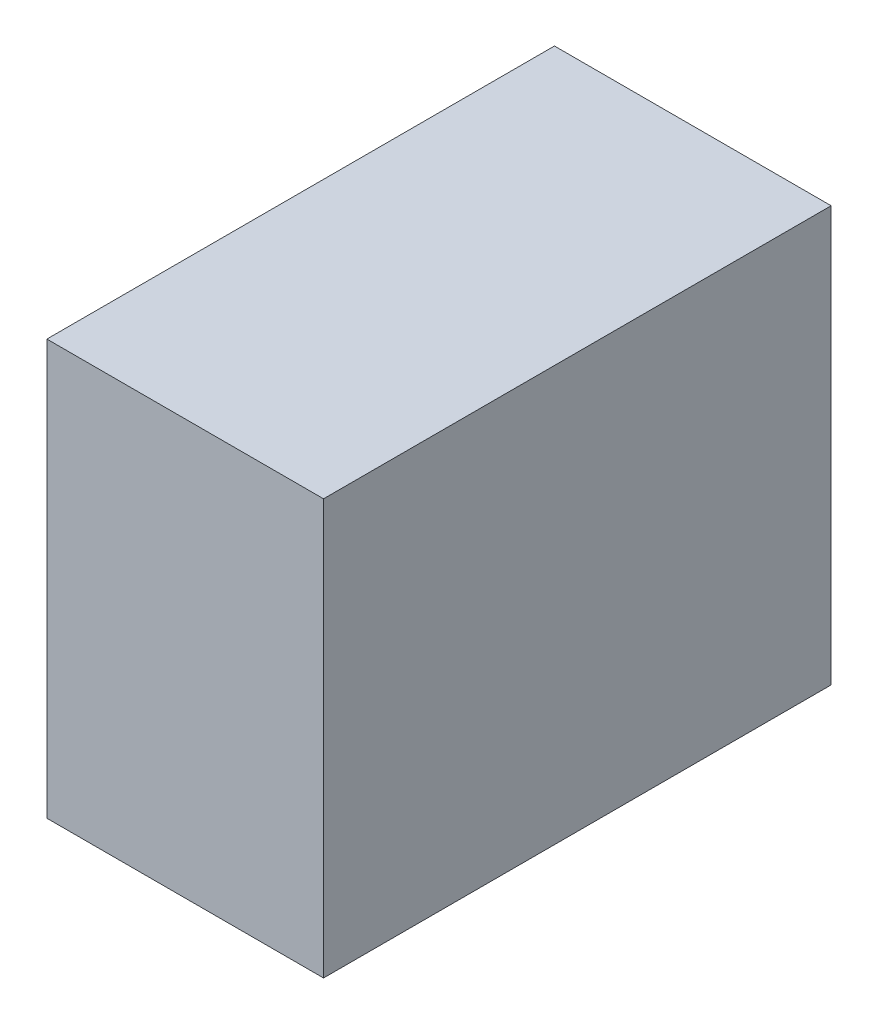
ISO-10303-21;
HEADER;
FILE_DESCRIPTION(('STEP AP214'),'2;1');
FILE_NAME('part.step','',(''),(''),'','','');
FILE_SCHEMA(('AUTOMOTIVE_DESIGN { 1 0 10303 214 1 1 1 1 }'));
ENDSEC;
DATA;
#1=APPLICATION_CONTEXT('core data for automotive mechanical design processes');
#2=APPLICATION_PROTOCOL_DEFINITION('international standard','automotive_design',2000,#1);
#3=PRODUCT_CONTEXT('',#1,'mechanical');
#4=PRODUCT('Part','Part','',(#3));
#5=PRODUCT_RELATED_PRODUCT_CATEGORY('part','',(#4));
#6=PRODUCT_DEFINITION_FORMATION('','',#4);
#7=PRODUCT_DEFINITION_CONTEXT('part definition',#1,'design');
#8=PRODUCT_DEFINITION('design','',#6,#7);
#9=PRODUCT_DEFINITION_SHAPE('','',#8);
#10=(LENGTH_UNIT() NAMED_UNIT(*) SI_UNIT(.MILLI.,.METRE.));
#11=(NAMED_UNIT(*) PLANE_ANGLE_UNIT() SI_UNIT($,.RADIAN.));
#12=(NAMED_UNIT(*) SI_UNIT($,.STERADIAN.) SOLID_ANGLE_UNIT());
#13=UNCERTAINTY_MEASURE_WITH_UNIT(LENGTH_MEASURE(1.E-05),#10,'distance_accuracy_value','');
#14=(GEOMETRIC_REPRESENTATION_CONTEXT(3) GLOBAL_UNCERTAINTY_ASSIGNED_CONTEXT((#13)) GLOBAL_UNIT_ASSIGNED_CONTEXT((#10,
#11,#12)) REPRESENTATION_CONTEXT('',''));
#15=CARTESIAN_POINT('',(0.,0.,0.));
#16=DIRECTION('',(0.,0.,1.));
#17=DIRECTION('',(1.,0.,0.));
#18=AXIS2_PLACEMENT_3D('',#15,#16,#17);
#19=CARTESIAN_POINT('',(-1.27,-1.905,4.66000084));
#20=DIRECTION('',(0.,0.,1.));
#21=DIRECTION('',(1.,0.,0.));
#22=AXIS2_PLACEMENT_3D('',#19,#20,#21);
#23=PLANE('',#22);
#24=DIRECTION('',(-1.,0.,0.));
#25=VECTOR('',#24,1.);
#26=CARTESIAN_POINT('',(1.27,-1.905,4.66000084));
#27=LINE('',#26,#25);
#28=CARTESIAN_POINT('',(1.27,-1.905,4.66000084));
#29=VERTEX_POINT('',#28);
#30=CARTESIAN_POINT('',(-1.27,-1.905,4.66000084));
#31=VERTEX_POINT('',#30);
#32=EDGE_CURVE('E28',#29,#31,#27,.T.);
#33=ORIENTED_EDGE('',*,*,#32,.F.);
#34=DIRECTION('',(0.,-1.,0.));
#35=VECTOR('',#34,1.);
#36=CARTESIAN_POINT('',(1.27,1.905,4.66000084));
#37=LINE('',#36,#35);
#38=CARTESIAN_POINT('',(1.27,1.905,4.66000084));
#39=VERTEX_POINT('',#38);
#40=EDGE_CURVE('E66',#39,#29,#37,.T.);
#41=ORIENTED_EDGE('',*,*,#40,.F.);
#42=DIRECTION('',(1.,0.,0.));
#43=VECTOR('',#42,1.);
#44=CARTESIAN_POINT('',(-1.27,1.905,4.66000084));
#45=LINE('',#44,#43);
#46=CARTESIAN_POINT('',(-1.27,1.905,4.66000084));
#47=VERTEX_POINT('',#46);
#48=EDGE_CURVE('E92',#47,#39,#45,.T.);
#49=ORIENTED_EDGE('',*,*,#48,.F.);
#50=DIRECTION('',(0.,1.,0.));
#51=VECTOR('',#50,1.);
#52=CARTESIAN_POINT('',(-1.27,-1.905,4.66000084));
#53=LINE('',#52,#51);
#54=EDGE_CURVE('E104',#31,#47,#53,.T.);
#55=ORIENTED_EDGE('',*,*,#54,.F.);
#56=EDGE_LOOP('',(#33,#41,#49,#55));
#57=FACE_BOUND('',#56,.T.);
#58=ADVANCED_FACE('F17',(#57),#23,.T.);
#59=CARTESIAN_POINT('',(-1.27,-1.905,0.));
#60=DIRECTION('',(0.,0.,1.));
#61=DIRECTION('',(1.,0.,0.));
#62=AXIS2_PLACEMENT_3D('',#59,#60,#61);
#63=PLANE('',#62);
#64=DIRECTION('',(0.,1.,0.));
#65=VECTOR('',#64,1.);
#66=CARTESIAN_POINT('',(-1.27,-1.905,0.));
#67=LINE('',#66,#65);
#68=CARTESIAN_POINT('',(-1.27,-1.905,0.));
#69=VERTEX_POINT('',#68);
#70=CARTESIAN_POINT('',(-1.27,1.905,0.));
#71=VERTEX_POINT('',#70);
#72=EDGE_CURVE('E85',#69,#71,#67,.T.);
#73=ORIENTED_EDGE('',*,*,#72,.T.);
#74=DIRECTION('',(1.,0.,0.));
#75=VECTOR('',#74,1.);
#76=CARTESIAN_POINT('',(-1.27,1.905,0.));
#77=LINE('',#76,#75);
#78=CARTESIAN_POINT('',(1.27,1.905,0.));
#79=VERTEX_POINT('',#78);
#80=EDGE_CURVE('E82',#71,#79,#77,.T.);
#81=ORIENTED_EDGE('',*,*,#80,.T.);
#82=DIRECTION('',(0.,-1.,0.));
#83=VECTOR('',#82,1.);
#84=CARTESIAN_POINT('',(1.27,1.905,0.));
#85=LINE('',#84,#83);
#86=CARTESIAN_POINT('',(1.27,-1.905,0.));
#87=VERTEX_POINT('',#86);
#88=EDGE_CURVE('E21',#79,#87,#85,.T.);
#89=ORIENTED_EDGE('',*,*,#88,.T.);
#90=DIRECTION('',(-1.,0.,0.));
#91=VECTOR('',#90,1.);
#92=CARTESIAN_POINT('',(1.27,-1.905,0.));
#93=LINE('',#92,#91);
#94=EDGE_CURVE('E11',#87,#69,#93,.T.);
#95=ORIENTED_EDGE('',*,*,#94,.T.);
#96=EDGE_LOOP('',(#73,#81,#89,#95));
#97=FACE_BOUND('',#96,.T.);
#98=ADVANCED_FACE('F83',(#97),#63,.F.);
#99=CARTESIAN_POINT('',(1.27,-1.905,0.));
#100=DIRECTION('',(0.,-1.,0.));
#101=DIRECTION('',(0.,0.,-1.));
#102=AXIS2_PLACEMENT_3D('',#99,#100,#101);
#103=PLANE('',#102);
#104=DIRECTION('',(0.,0.,1.));
#105=VECTOR('',#104,1.);
#106=CARTESIAN_POINT('',(1.27,-1.905,0.));
#107=LINE('',#106,#105);
#108=EDGE_CURVE('E78',#87,#29,#107,.T.);
#109=ORIENTED_EDGE('',*,*,#108,.T.);
#110=ORIENTED_EDGE('',*,*,#32,.T.);
#111=DIRECTION('',(0.,0.,1.));
#112=VECTOR('',#111,1.);
#113=CARTESIAN_POINT('',(-1.27,-1.905,0.));
#114=LINE('',#113,#112);
#115=EDGE_CURVE('E180',#69,#31,#114,.T.);
#116=ORIENTED_EDGE('',*,*,#115,.F.);
#117=ORIENTED_EDGE('',*,*,#94,.F.);
#118=EDGE_LOOP('',(#109,#110,#116,#117));
#119=FACE_BOUND('',#118,.T.);
#120=ADVANCED_FACE('F116',(#119),#103,.T.);
#121=CARTESIAN_POINT('',(1.27,1.905,0.));
#122=DIRECTION('',(1.,0.,0.));
#123=DIRECTION('',(0.,1.,0.));
#124=AXIS2_PLACEMENT_3D('',#121,#122,#123);
#125=PLANE('',#124);
#126=DIRECTION('',(0.,0.,1.));
#127=VECTOR('',#126,1.);
#128=CARTESIAN_POINT('',(1.27,1.905,0.));
#129=LINE('',#128,#127);
#130=EDGE_CURVE('E76',#79,#39,#129,.T.);
#131=ORIENTED_EDGE('',*,*,#130,.T.);
#132=ORIENTED_EDGE('',*,*,#40,.T.);
#133=ORIENTED_EDGE('',*,*,#108,.F.);
#134=ORIENTED_EDGE('',*,*,#88,.F.);
#135=EDGE_LOOP('',(#131,#132,#133,#134));
#136=FACE_BOUND('',#135,.T.);
#137=ADVANCED_FACE('F74',(#136),#125,.T.);
#138=CARTESIAN_POINT('',(-1.27,1.905,0.));
#139=DIRECTION('',(0.,1.,0.));
#140=DIRECTION('',(1.,0.,0.));
#141=AXIS2_PLACEMENT_3D('',#138,#139,#140);
#142=PLANE('',#141);
#143=DIRECTION('',(0.,0.,1.));
#144=VECTOR('',#143,1.);
#145=CARTESIAN_POINT('',(-1.27,1.905,0.));
#146=LINE('',#145,#144);
#147=EDGE_CURVE('E103',#71,#47,#146,.T.);
#148=ORIENTED_EDGE('',*,*,#147,.T.);
#149=ORIENTED_EDGE('',*,*,#48,.T.);
#150=ORIENTED_EDGE('',*,*,#130,.F.);
#151=ORIENTED_EDGE('',*,*,#80,.F.);
#152=EDGE_LOOP('',(#148,#149,#150,#151));
#153=FACE_BOUND('',#152,.T.);
#154=ADVANCED_FACE('F91',(#153),#142,.T.);
#155=CARTESIAN_POINT('',(-1.27,-1.905,0.));
#156=DIRECTION('',(-1.,0.,0.));
#157=DIRECTION('',(0.,0.,1.));
#158=AXIS2_PLACEMENT_3D('',#155,#156,#157);
#159=PLANE('',#158);
#160=ORIENTED_EDGE('',*,*,#115,.T.);
#161=ORIENTED_EDGE('',*,*,#54,.T.);
#162=ORIENTED_EDGE('',*,*,#147,.F.);
#163=ORIENTED_EDGE('',*,*,#72,.F.);
#164=EDGE_LOOP('',(#160,#161,#162,#163));
#165=FACE_BOUND('',#164,.T.);
#166=ADVANCED_FACE('F19',(#165),#159,.T.);
#167=CLOSED_SHELL('',(#58,#98,#120,#137,#154,#166));
#168=MANIFOLD_SOLID_BREP('B1',#167);
#169=ADVANCED_BREP_SHAPE_REPRESENTATION('',(#18,#168),#14);
#170=SHAPE_DEFINITION_REPRESENTATION(#9,#169);
ENDSEC;
END-ISO-10303-21;
